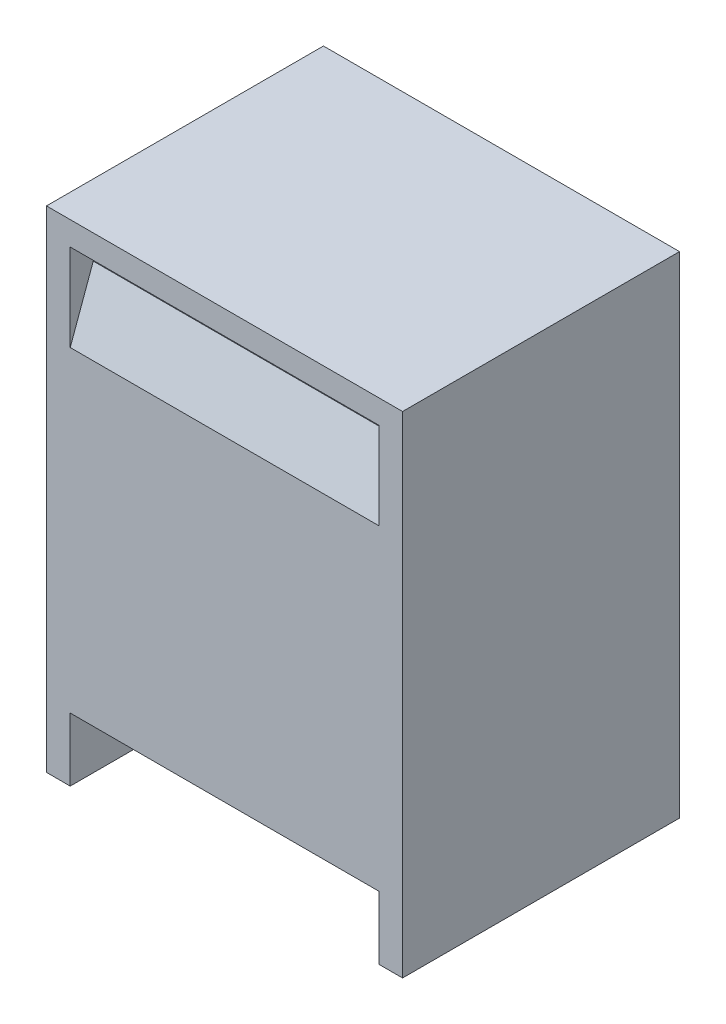
ISO-10303-21;
HEADER;
FILE_DESCRIPTION(('STEP AP214'),'2;1');
FILE_NAME('part.step','',(''),(''),'','','');
FILE_SCHEMA(('AUTOMOTIVE_DESIGN { 1 0 10303 214 1 1 1 1 }'));
ENDSEC;
DATA;
#1=APPLICATION_CONTEXT('core data for automotive mechanical design processes');
#2=APPLICATION_PROTOCOL_DEFINITION('international standard','automotive_design',2000,#1);
#3=PRODUCT_CONTEXT('',#1,'mechanical');
#4=PRODUCT('Part','Part','',(#3));
#5=PRODUCT_RELATED_PRODUCT_CATEGORY('part','',(#4));
#6=PRODUCT_DEFINITION_FORMATION('','',#4);
#7=PRODUCT_DEFINITION_CONTEXT('part definition',#1,'design');
#8=PRODUCT_DEFINITION('design','',#6,#7);
#9=PRODUCT_DEFINITION_SHAPE('','',#8);
#10=(LENGTH_UNIT() NAMED_UNIT(*) SI_UNIT(.MILLI.,.METRE.));
#11=(NAMED_UNIT(*) PLANE_ANGLE_UNIT() SI_UNIT($,.RADIAN.));
#12=(NAMED_UNIT(*) SI_UNIT($,.STERADIAN.) SOLID_ANGLE_UNIT());
#13=UNCERTAINTY_MEASURE_WITH_UNIT(LENGTH_MEASURE(1.E-05),#10,'distance_accuracy_value','');
#14=(GEOMETRIC_REPRESENTATION_CONTEXT(3) GLOBAL_UNCERTAINTY_ASSIGNED_CONTEXT((#13)) GLOBAL_UNIT_ASSIGNED_CONTEXT((#10,
#11,#12)) REPRESENTATION_CONTEXT('',''));
#15=CARTESIAN_POINT('',(0.,0.,0.));
#16=DIRECTION('',(0.,0.,1.));
#17=DIRECTION('',(1.,0.,0.));
#18=AXIS2_PLACEMENT_3D('',#15,#16,#17);
#19=CARTESIAN_POINT('',(420.,480.,-405.215991787096));
#20=DIRECTION('',(1.,0.,0.));
#21=DIRECTION('',(0.,0.,-1.));
#22=AXIS2_PLACEMENT_3D('',#19,#20,#21);
#23=PLANE('',#22);
#24=DIRECTION('',(0.,0.939692620785908,-0.342020143325669));
#25=VECTOR('',#24,1.);
#26=CARTESIAN_POINT('',(420.,722.721741078939,261.656511037998));
#27=LINE('',#26,#25);
#28=CARTESIAN_POINT('',(420.,480.,350.));
#29=VERTEX_POINT('',#28);
#30=CARTESIAN_POINT('',(420.,560.,320.882381258704));
#31=VERTEX_POINT('',#30);
#32=EDGE_CURVE('E162',#29,#31,#27,.T.);
#33=ORIENTED_EDGE('',*,*,#32,.F.);
#34=DIRECTION('',(0.,1.,0.));
#35=VECTOR('',#34,1.);
#36=CARTESIAN_POINT('',(420.,480.,350.));
#37=LINE('',#36,#35);
#38=CARTESIAN_POINT('',(420.,590.,350.));
#39=VERTEX_POINT('',#38);
#40=EDGE_CURVE('E167',#29,#39,#37,.T.);
#41=ORIENTED_EDGE('',*,*,#40,.T.);
#42=DIRECTION('',(0.,0.,1.));
#43=VECTOR('',#42,1.);
#44=CARTESIAN_POINT('',(420.,590.,-405.215991787096));
#45=LINE('',#44,#43);
#46=CARTESIAN_POINT('',(420.,590.,0.));
#47=VERTEX_POINT('',#46);
#48=EDGE_CURVE('E183',#47,#39,#45,.T.);
#49=ORIENTED_EDGE('',*,*,#48,.F.);
#50=DIRECTION('',(0.,1.,0.));
#51=VECTOR('',#50,1.);
#52=CARTESIAN_POINT('',(420.,480.,0.));
#53=LINE('',#52,#51);
#54=CARTESIAN_POINT('',(420.,480.,0.));
#55=VERTEX_POINT('',#54);
#56=EDGE_CURVE('E175',#55,#47,#53,.T.);
#57=ORIENTED_EDGE('',*,*,#56,.F.);
#58=DIRECTION('',(0.,-0.93969262078591,-0.342020143325663));
#59=VECTOR('',#58,1.);
#60=CARTESIAN_POINT('',(420.,349.766090616208,-47.4012665078214));
#61=LINE('',#60,#59);
#62=CARTESIAN_POINT('',(420.,560.,29.1176187412956));
#63=VERTEX_POINT('',#62);
#64=EDGE_CURVE('E56',#63,#55,#61,.T.);
#65=ORIENTED_EDGE('',*,*,#64,.F.);
#66=DIRECTION('',(0.,0.,-1.));
#67=VECTOR('',#66,1.);
#68=CARTESIAN_POINT('',(420.,560.,-405.215991787096));
#69=LINE('',#68,#67);
#70=EDGE_CURVE('E51',#31,#63,#69,.T.);
#71=ORIENTED_EDGE('',*,*,#70,.F.);
#72=EDGE_LOOP('',(#33,#41,#49,#57,#65,#71));
#73=FACE_BOUND('',#72,.T.);
#74=ADVANCED_FACE('F36',(#73),#23,.F.);
#75=CARTESIAN_POINT('',(30.,480.,-405.215991787096));
#76=DIRECTION('',(-1.,0.,0.));
#77=DIRECTION('',(0.,0.,1.));
#78=AXIS2_PLACEMENT_3D('',#75,#76,#77);
#79=PLANE('',#78);
#80=DIRECTION('',(0.,-0.939692620785908,0.342020143325669));
#81=VECTOR('',#80,1.);
#82=CARTESIAN_POINT('',(30.,480.,350.));
#83=LINE('',#82,#81);
#84=CARTESIAN_POINT('',(30.,560.,320.882381258704));
#85=VERTEX_POINT('',#84);
#86=CARTESIAN_POINT('',(30.,480.,350.));
#87=VERTEX_POINT('',#86);
#88=EDGE_CURVE('E141',#85,#87,#83,.T.);
#89=ORIENTED_EDGE('',*,*,#88,.F.);
#90=DIRECTION('',(0.,0.,1.));
#91=VECTOR('',#90,1.);
#92=CARTESIAN_POINT('',(30.,560.,320.882381258704));
#93=LINE('',#92,#91);
#94=CARTESIAN_POINT('',(30.,560.,29.1176187412957));
#95=VERTEX_POINT('',#94);
#96=EDGE_CURVE('E134',#95,#85,#93,.T.);
#97=ORIENTED_EDGE('',*,*,#96,.F.);
#98=DIRECTION('',(0.,0.93969262078591,0.342020143325663));
#99=VECTOR('',#98,1.);
#100=CARTESIAN_POINT('',(30.,560.,29.1176187412957));
#101=LINE('',#100,#99);
#102=CARTESIAN_POINT('',(30.,480.,0.));
#103=VERTEX_POINT('',#102);
#104=EDGE_CURVE('E138',#103,#95,#101,.T.);
#105=ORIENTED_EDGE('',*,*,#104,.F.);
#106=DIRECTION('',(0.,-1.,0.));
#107=VECTOR('',#106,1.);
#108=CARTESIAN_POINT('',(30.,480.,0.));
#109=LINE('',#108,#107);
#110=CARTESIAN_POINT('',(30.,590.,0.));
#111=VERTEX_POINT('',#110);
#112=EDGE_CURVE('E176',#111,#103,#109,.T.);
#113=ORIENTED_EDGE('',*,*,#112,.F.);
#114=DIRECTION('',(0.,0.,1.));
#115=VECTOR('',#114,1.);
#116=CARTESIAN_POINT('',(30.,590.,-405.215991787096));
#117=LINE('',#116,#115);
#118=CARTESIAN_POINT('',(30.,590.,350.));
#119=VERTEX_POINT('',#118);
#120=EDGE_CURVE('E179',#111,#119,#117,.T.);
#121=ORIENTED_EDGE('',*,*,#120,.T.);
#122=DIRECTION('',(0.,-1.,0.));
#123=VECTOR('',#122,1.);
#124=CARTESIAN_POINT('',(30.,480.,350.));
#125=LINE('',#124,#123);
#126=EDGE_CURVE('E164',#119,#87,#125,.T.);
#127=ORIENTED_EDGE('',*,*,#126,.T.);
#128=EDGE_LOOP('',(#89,#97,#105,#113,#121,#127));
#129=FACE_BOUND('',#128,.T.);
#130=ADVANCED_FACE('F136',(#129),#79,.F.);
#131=CARTESIAN_POINT('',(0.,0.,350.));
#132=DIRECTION('',(0.,1.,0.));
#133=DIRECTION('',(0.,0.,1.));
#134=AXIS2_PLACEMENT_3D('',#131,#132,#133);
#135=PLANE('',#134);
#136=DIRECTION('',(1.,0.,0.));
#137=VECTOR('',#136,1.);
#138=CARTESIAN_POINT('',(0.,0.,350.));
#139=LINE('',#138,#137);
#140=CARTESIAN_POINT('',(420.,0.,350.));
#141=VERTEX_POINT('',#140);
#142=CARTESIAN_POINT('',(450.,0.,350.));
#143=VERTEX_POINT('',#142);
#144=EDGE_CURVE('E218',#141,#143,#139,.T.);
#145=ORIENTED_EDGE('',*,*,#144,.F.);
#146=DIRECTION('',(0.,0.,1.));
#147=VECTOR('',#146,1.);
#148=CARTESIAN_POINT('',(420.,0.,-398.120584747888));
#149=LINE('',#148,#147);
#150=CARTESIAN_POINT('',(420.,0.,-1.11022302462516E-13));
#151=VERTEX_POINT('',#150);
#152=EDGE_CURVE('E192',#151,#141,#149,.T.);
#153=ORIENTED_EDGE('',*,*,#152,.F.);
#154=DIRECTION('',(1.,0.,0.));
#155=VECTOR('',#154,1.);
#156=CARTESIAN_POINT('',(0.,0.,0.));
#157=LINE('',#156,#155);
#158=CARTESIAN_POINT('',(450.,0.,0.));
#159=VERTEX_POINT('',#158);
#160=EDGE_CURVE('E230',#151,#159,#157,.T.);
#161=ORIENTED_EDGE('',*,*,#160,.T.);
#162=DIRECTION('',(0.,0.,-1.));
#163=VECTOR('',#162,1.);
#164=CARTESIAN_POINT('',(450.,0.,350.));
#165=LINE('',#164,#163);
#166=EDGE_CURVE('E44',#143,#159,#165,.T.);
#167=ORIENTED_EDGE('',*,*,#166,.F.);
#168=EDGE_LOOP('',(#145,#153,#161,#167));
#169=FACE_BOUND('',#168,.T.);
#170=ADVANCED_FACE('F268',(#169),#135,.F.);
#171=CARTESIAN_POINT('',(0.,0.,350.));
#172=DIRECTION('',(1.,0.,0.));
#173=DIRECTION('',(0.,0.,-1.));
#174=AXIS2_PLACEMENT_3D('',#171,#172,#173);
#175=PLANE('',#174);
#176=DIRECTION('',(0.,-1.,0.));
#177=VECTOR('',#176,1.);
#178=CARTESIAN_POINT('',(0.,0.,0.));
#179=LINE('',#178,#177);
#180=CARTESIAN_POINT('',(0.,620.,0.));
#181=VERTEX_POINT('',#180);
#182=CARTESIAN_POINT('',(0.,0.,0.));
#183=VERTEX_POINT('',#182);
#184=EDGE_CURVE('E214',#181,#183,#179,.T.);
#185=ORIENTED_EDGE('',*,*,#184,.T.);
#186=DIRECTION('',(0.,0.,-1.));
#187=VECTOR('',#186,1.);
#188=CARTESIAN_POINT('',(0.,0.,350.));
#189=LINE('',#188,#187);
#190=CARTESIAN_POINT('',(0.,0.,350.));
#191=VERTEX_POINT('',#190);
#192=EDGE_CURVE('E11',#191,#183,#189,.T.);
#193=ORIENTED_EDGE('',*,*,#192,.F.);
#194=DIRECTION('',(0.,-1.,0.));
#195=VECTOR('',#194,1.);
#196=CARTESIAN_POINT('',(0.,0.,350.));
#197=LINE('',#196,#195);
#198=CARTESIAN_POINT('',(0.,620.,350.));
#199=VERTEX_POINT('',#198);
#200=EDGE_CURVE('E215',#199,#191,#197,.T.);
#201=ORIENTED_EDGE('',*,*,#200,.F.);
#202=DIRECTION('',(0.,0.,-1.));
#203=VECTOR('',#202,1.);
#204=CARTESIAN_POINT('',(0.,620.,350.));
#205=LINE('',#204,#203);
#206=EDGE_CURVE('E227',#199,#181,#205,.T.);
#207=ORIENTED_EDGE('',*,*,#206,.T.);
#208=EDGE_LOOP('',(#185,#193,#201,#207));
#209=FACE_BOUND('',#208,.T.);
#210=ADVANCED_FACE('F38',(#209),#175,.F.);
#211=CARTESIAN_POINT('',(30.,0.,0.));
#212=VERTEX_POINT('',#211);
#213=EDGE_CURVE('E231',#183,#212,#157,.T.);
#214=ORIENTED_EDGE('',*,*,#213,.T.);
#215=DIRECTION('',(0.,0.,1.));
#216=VECTOR('',#215,1.);
#217=CARTESIAN_POINT('',(30.,0.,-398.120584747888));
#218=LINE('',#217,#216);
#219=CARTESIAN_POINT('',(30.,0.,350.));
#220=VERTEX_POINT('',#219);
#221=EDGE_CURVE('E200',#212,#220,#218,.T.);
#222=ORIENTED_EDGE('',*,*,#221,.T.);
#223=EDGE_CURVE('E220',#191,#220,#139,.T.);
#224=ORIENTED_EDGE('',*,*,#223,.F.);
#225=ORIENTED_EDGE('',*,*,#192,.T.);
#226=EDGE_LOOP('',(#214,#222,#224,#225));
#227=FACE_BOUND('',#226,.T.);
#228=ADVANCED_FACE('F278',(#227),#135,.F.);
#229=CARTESIAN_POINT('',(450.,0.,350.));
#230=DIRECTION('',(-1.,0.,0.));
#231=DIRECTION('',(0.,0.,1.));
#232=AXIS2_PLACEMENT_3D('',#229,#230,#231);
#233=PLANE('',#232);
#234=DIRECTION('',(0.,0.,-1.));
#235=VECTOR('',#234,1.);
#236=CARTESIAN_POINT('',(450.,620.,350.));
#237=LINE('',#236,#235);
#238=CARTESIAN_POINT('',(450.,620.,350.));
#239=VERTEX_POINT('',#238);
#240=CARTESIAN_POINT('',(450.,620.,0.));
#241=VERTEX_POINT('',#240);
#242=EDGE_CURVE('E239',#239,#241,#237,.T.);
#243=ORIENTED_EDGE('',*,*,#242,.F.);
#244=DIRECTION('',(0.,1.,0.));
#245=VECTOR('',#244,1.);
#246=CARTESIAN_POINT('',(450.,0.,350.));
#247=LINE('',#246,#245);
#248=EDGE_CURVE('E223',#143,#239,#247,.T.);
#249=ORIENTED_EDGE('',*,*,#248,.F.);
#250=ORIENTED_EDGE('',*,*,#166,.T.);
#251=DIRECTION('',(0.,1.,0.));
#252=VECTOR('',#251,1.);
#253=CARTESIAN_POINT('',(450.,0.,0.));
#254=LINE('',#253,#252);
#255=EDGE_CURVE('E234',#159,#241,#254,.T.);
#256=ORIENTED_EDGE('',*,*,#255,.T.);
#257=EDGE_LOOP('',(#243,#249,#250,#256));
#258=FACE_BOUND('',#257,.T.);
#259=ADVANCED_FACE('F247',(#258),#233,.F.);
#260=CARTESIAN_POINT('',(0.,620.,350.));
#261=DIRECTION('',(0.,-1.,0.));
#262=DIRECTION('',(0.,0.,-1.));
#263=AXIS2_PLACEMENT_3D('',#260,#261,#262);
#264=PLANE('',#263);
#265=DIRECTION('',(-1.,0.,0.));
#266=VECTOR('',#265,1.);
#267=CARTESIAN_POINT('',(0.,620.,0.));
#268=LINE('',#267,#266);
#269=EDGE_CURVE('E219',#241,#181,#268,.T.);
#270=ORIENTED_EDGE('',*,*,#269,.T.);
#271=ORIENTED_EDGE('',*,*,#206,.F.);
#272=DIRECTION('',(-1.,0.,0.));
#273=VECTOR('',#272,1.);
#274=CARTESIAN_POINT('',(0.,620.,350.));
#275=LINE('',#274,#273);
#276=EDGE_CURVE('E225',#239,#199,#275,.T.);
#277=ORIENTED_EDGE('',*,*,#276,.F.);
#278=ORIENTED_EDGE('',*,*,#242,.T.);
#279=EDGE_LOOP('',(#270,#271,#277,#278));
#280=FACE_BOUND('',#279,.T.);
#281=ADVANCED_FACE('F257',(#280),#264,.F.);
#282=CARTESIAN_POINT('',(0.,0.,350.));
#283=DIRECTION('',(0.,0.,-1.));
#284=DIRECTION('',(-1.,0.,0.));
#285=AXIS2_PLACEMENT_3D('',#282,#283,#284);
#286=PLANE('',#285);
#287=ORIENTED_EDGE('',*,*,#40,.F.);
#288=DIRECTION('',(1.,0.,0.));
#289=VECTOR('',#288,1.);
#290=CARTESIAN_POINT('',(30.,480.,350.));
#291=LINE('',#290,#289);
#292=EDGE_CURVE('E170',#87,#29,#291,.T.);
#293=ORIENTED_EDGE('',*,*,#292,.F.);
#294=ORIENTED_EDGE('',*,*,#126,.F.);
#295=DIRECTION('',(-1.,0.,0.));
#296=VECTOR('',#295,1.);
#297=CARTESIAN_POINT('',(30.,590.,350.));
#298=LINE('',#297,#296);
#299=EDGE_CURVE('E165',#39,#119,#298,.T.);
#300=ORIENTED_EDGE('',*,*,#299,.F.);
#301=EDGE_LOOP('',(#287,#293,#294,#300));
#302=FACE_BOUND('',#301,.T.);
#303=ORIENTED_EDGE('',*,*,#248,.T.);
#304=ORIENTED_EDGE('',*,*,#276,.T.);
#305=ORIENTED_EDGE('',*,*,#200,.T.);
#306=ORIENTED_EDGE('',*,*,#223,.T.);
#307=DIRECTION('',(0.,-1.,0.));
#308=VECTOR('',#307,1.);
#309=CARTESIAN_POINT('',(30.,0.,350.));
#310=LINE('',#309,#308);
#311=CARTESIAN_POINT('',(30.,80.,350.));
#312=VERTEX_POINT('',#311);
#313=EDGE_CURVE('E178',#312,#220,#310,.T.);
#314=ORIENTED_EDGE('',*,*,#313,.F.);
#315=DIRECTION('',(-1.,0.,0.));
#316=VECTOR('',#315,1.);
#317=CARTESIAN_POINT('',(30.,80.,350.));
#318=LINE('',#317,#316);
#319=CARTESIAN_POINT('',(420.,80.,350.));
#320=VERTEX_POINT('',#319);
#321=EDGE_CURVE('E189',#320,#312,#318,.T.);
#322=ORIENTED_EDGE('',*,*,#321,.F.);
#323=DIRECTION('',(0.,1.,0.));
#324=VECTOR('',#323,1.);
#325=CARTESIAN_POINT('',(420.,0.,350.));
#326=LINE('',#325,#324);
#327=EDGE_CURVE('E193',#141,#320,#326,.T.);
#328=ORIENTED_EDGE('',*,*,#327,.F.);
#329=ORIENTED_EDGE('',*,*,#144,.T.);
#330=EDGE_LOOP('',(#303,#304,#305,#306,#314,#322,#328,#329));
#331=FACE_BOUND('',#330,.T.);
#332=ADVANCED_FACE('F263',(#302,#331),#286,.F.);
#333=CARTESIAN_POINT('',(0.,0.,0.));
#334=DIRECTION('',(0.,0.,-1.));
#335=DIRECTION('',(-1.,0.,0.));
#336=AXIS2_PLACEMENT_3D('',#333,#334,#335);
#337=PLANE('',#336);
#338=DIRECTION('',(1.,0.,0.));
#339=VECTOR('',#338,1.);
#340=CARTESIAN_POINT('',(30.,480.,0.));
#341=LINE('',#340,#339);
#342=EDGE_CURVE('E155',#103,#55,#341,.T.);
#343=ORIENTED_EDGE('',*,*,#342,.T.);
#344=ORIENTED_EDGE('',*,*,#56,.T.);
#345=DIRECTION('',(-1.,0.,0.));
#346=VECTOR('',#345,1.);
#347=CARTESIAN_POINT('',(30.,590.,0.));
#348=LINE('',#347,#346);
#349=EDGE_CURVE('E180',#47,#111,#348,.T.);
#350=ORIENTED_EDGE('',*,*,#349,.T.);
#351=ORIENTED_EDGE('',*,*,#112,.T.);
#352=EDGE_LOOP('',(#343,#344,#350,#351));
#353=FACE_BOUND('',#352,.T.);
#354=ORIENTED_EDGE('',*,*,#269,.F.);
#355=ORIENTED_EDGE('',*,*,#255,.F.);
#356=ORIENTED_EDGE('',*,*,#160,.F.);
#357=DIRECTION('',(0.,1.,0.));
#358=VECTOR('',#357,1.);
#359=CARTESIAN_POINT('',(420.,0.,0.));
#360=LINE('',#359,#358);
#361=CARTESIAN_POINT('',(420.,80.,0.));
#362=VERTEX_POINT('',#361);
#363=EDGE_CURVE('E206',#151,#362,#360,.T.);
#364=ORIENTED_EDGE('',*,*,#363,.T.);
#365=DIRECTION('',(-1.,0.,0.));
#366=VECTOR('',#365,1.);
#367=CARTESIAN_POINT('',(30.,80.,0.));
#368=LINE('',#367,#366);
#369=CARTESIAN_POINT('',(30.,80.,0.));
#370=VERTEX_POINT('',#369);
#371=EDGE_CURVE('E202',#362,#370,#368,.T.);
#372=ORIENTED_EDGE('',*,*,#371,.T.);
#373=DIRECTION('',(0.,-1.,0.));
#374=VECTOR('',#373,1.);
#375=CARTESIAN_POINT('',(30.,0.,0.));
#376=LINE('',#375,#374);
#377=EDGE_CURVE('E197',#370,#212,#376,.T.);
#378=ORIENTED_EDGE('',*,*,#377,.T.);
#379=ORIENTED_EDGE('',*,*,#213,.F.);
#380=ORIENTED_EDGE('',*,*,#184,.F.);
#381=EDGE_LOOP('',(#354,#355,#356,#364,#372,#378,#379,#380));
#382=FACE_BOUND('',#381,.T.);
#383=ADVANCED_FACE('F253',(#353,#382),#337,.T.);
#384=CARTESIAN_POINT('',(420.,0.,-398.120584747888));
#385=DIRECTION('',(1.,0.,0.));
#386=DIRECTION('',(0.,0.,-1.));
#387=AXIS2_PLACEMENT_3D('',#384,#385,#386);
#388=PLANE('',#387);
#389=ORIENTED_EDGE('',*,*,#152,.T.);
#390=ORIENTED_EDGE('',*,*,#327,.T.);
#391=DIRECTION('',(0.,0.,1.));
#392=VECTOR('',#391,1.);
#393=CARTESIAN_POINT('',(420.,80.,-398.120584747888));
#394=LINE('',#393,#392);
#395=EDGE_CURVE('E205',#362,#320,#394,.T.);
#396=ORIENTED_EDGE('',*,*,#395,.F.);
#397=ORIENTED_EDGE('',*,*,#363,.F.);
#398=EDGE_LOOP('',(#389,#390,#396,#397));
#399=FACE_BOUND('',#398,.T.);
#400=ADVANCED_FACE('F270',(#399),#388,.F.);
#401=CARTESIAN_POINT('',(30.,80.,-398.120584747888));
#402=DIRECTION('',(0.,1.,0.));
#403=DIRECTION('',(0.,0.,1.));
#404=AXIS2_PLACEMENT_3D('',#401,#402,#403);
#405=PLANE('',#404);
#406=ORIENTED_EDGE('',*,*,#395,.T.);
#407=ORIENTED_EDGE('',*,*,#321,.T.);
#408=DIRECTION('',(0.,0.,1.));
#409=VECTOR('',#408,1.);
#410=CARTESIAN_POINT('',(30.,80.,-398.120584747888));
#411=LINE('',#410,#409);
#412=EDGE_CURVE('E201',#370,#312,#411,.T.);
#413=ORIENTED_EDGE('',*,*,#412,.F.);
#414=ORIENTED_EDGE('',*,*,#371,.F.);
#415=EDGE_LOOP('',(#406,#407,#413,#414));
#416=FACE_BOUND('',#415,.T.);
#417=ADVANCED_FACE('F274',(#416),#405,.F.);
#418=CARTESIAN_POINT('',(30.,0.,-398.120584747888));
#419=DIRECTION('',(-1.,0.,0.));
#420=DIRECTION('',(0.,0.,1.));
#421=AXIS2_PLACEMENT_3D('',#418,#419,#420);
#422=PLANE('',#421);
#423=ORIENTED_EDGE('',*,*,#412,.T.);
#424=ORIENTED_EDGE('',*,*,#313,.T.);
#425=ORIENTED_EDGE('',*,*,#221,.F.);
#426=ORIENTED_EDGE('',*,*,#377,.F.);
#427=EDGE_LOOP('',(#423,#424,#425,#426));
#428=FACE_BOUND('',#427,.T.);
#429=ADVANCED_FACE('F276',(#428),#422,.F.);
#430=CARTESIAN_POINT('',(30.,590.,-405.215991787096));
#431=DIRECTION('',(0.,1.,0.));
#432=DIRECTION('',(0.,0.,1.));
#433=AXIS2_PLACEMENT_3D('',#430,#431,#432);
#434=PLANE('',#433);
#435=ORIENTED_EDGE('',*,*,#48,.T.);
#436=ORIENTED_EDGE('',*,*,#299,.T.);
#437=ORIENTED_EDGE('',*,*,#120,.F.);
#438=ORIENTED_EDGE('',*,*,#349,.F.);
#439=EDGE_LOOP('',(#435,#436,#437,#438));
#440=FACE_BOUND('',#439,.T.);
#441=ADVANCED_FACE('F294',(#440),#434,.F.);
#442=CARTESIAN_POINT('',(815.9105591366,480.,350.));
#443=DIRECTION('',(0.,-0.342020143325669,-0.939692620785908));
#444=DIRECTION('',(0.,0.939692620785908,-0.342020143325669));
#445=AXIS2_PLACEMENT_3D('',#442,#443,#444);
#446=PLANE('',#445);
#447=ORIENTED_EDGE('',*,*,#292,.T.);
#448=ORIENTED_EDGE('',*,*,#32,.T.);
#449=DIRECTION('',(-1.,0.,0.));
#450=VECTOR('',#449,1.);
#451=CARTESIAN_POINT('',(815.9105591366,560.,320.882381258704));
#452=LINE('',#451,#450);
#453=EDGE_CURVE('E150',#31,#85,#452,.T.);
#454=ORIENTED_EDGE('',*,*,#453,.T.);
#455=ORIENTED_EDGE('',*,*,#88,.T.);
#456=EDGE_LOOP('',(#447,#448,#454,#455));
#457=FACE_BOUND('',#456,.T.);
#458=ADVANCED_FACE('F341',(#457),#446,.F.);
#459=CARTESIAN_POINT('',(815.9105591366,560.,320.882381258704));
#460=DIRECTION('',(0.,-1.,0.));
#461=DIRECTION('',(0.,0.,-1.));
#462=AXIS2_PLACEMENT_3D('',#459,#460,#461);
#463=PLANE('',#462);
#464=ORIENTED_EDGE('',*,*,#453,.F.);
#465=ORIENTED_EDGE('',*,*,#70,.T.);
#466=DIRECTION('',(-1.,0.,0.));
#467=VECTOR('',#466,1.);
#468=CARTESIAN_POINT('',(815.9105591366,560.,29.1176187412957));
#469=LINE('',#468,#467);
#470=EDGE_CURVE('E147',#63,#95,#469,.T.);
#471=ORIENTED_EDGE('',*,*,#470,.T.);
#472=ORIENTED_EDGE('',*,*,#96,.T.);
#473=EDGE_LOOP('',(#464,#465,#471,#472));
#474=FACE_BOUND('',#473,.T.);
#475=ADVANCED_FACE('F148',(#474),#463,.F.);
#476=CARTESIAN_POINT('',(815.9105591366,560.,29.1176187412957));
#477=DIRECTION('',(0.,-0.342020143325663,0.93969262078591));
#478=DIRECTION('',(0.,-0.93969262078591,-0.342020143325663));
#479=AXIS2_PLACEMENT_3D('',#476,#477,#478);
#480=PLANE('',#479);
#481=ORIENTED_EDGE('',*,*,#470,.F.);
#482=ORIENTED_EDGE('',*,*,#64,.T.);
#483=ORIENTED_EDGE('',*,*,#342,.F.);
#484=ORIENTED_EDGE('',*,*,#104,.T.);
#485=EDGE_LOOP('',(#481,#482,#483,#484));
#486=FACE_BOUND('',#485,.T.);
#487=ADVANCED_FACE('F153',(#486),#480,.F.);
#488=CLOSED_SHELL('',(#74,#130,#170,#210,#228,#259,#281,#332,#383,#400,#417,#429,#441,#458,#475,#487));
#489=MANIFOLD_SOLID_BREP('B2',#488);
#490=ADVANCED_BREP_SHAPE_REPRESENTATION('',(#18,#489),#14);
#491=SHAPE_DEFINITION_REPRESENTATION(#9,#490);
ENDSEC;
END-ISO-10303-21;
